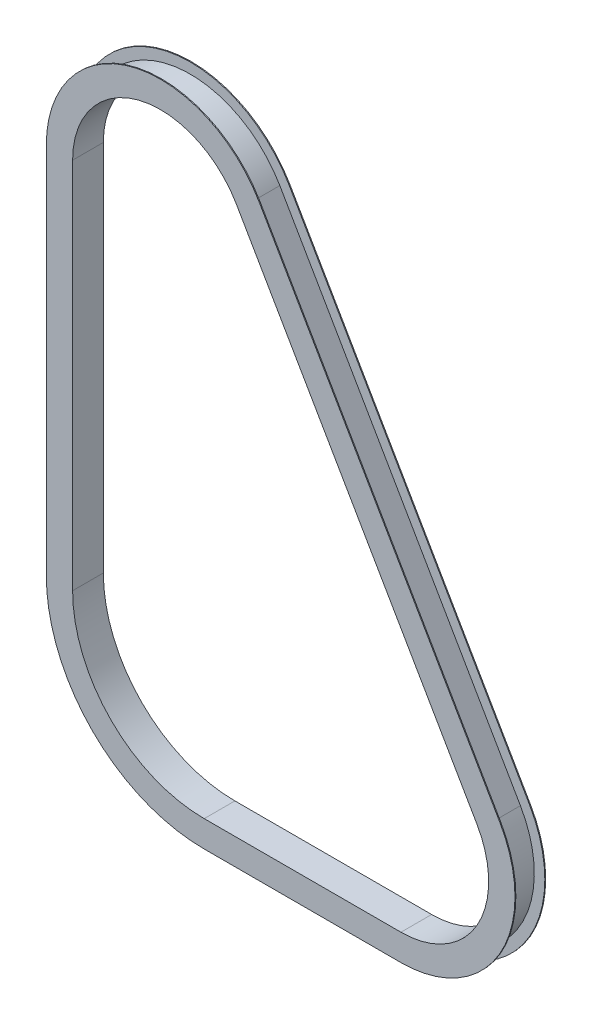
ISO-10303-21;
HEADER;
FILE_DESCRIPTION(('STEP AP214'),'2;1');
FILE_NAME('part.step','',(''),(''),'','','');
FILE_SCHEMA(('AUTOMOTIVE_DESIGN { 1 0 10303 214 1 1 1 1 }'));
ENDSEC;
DATA;
#1=APPLICATION_CONTEXT('core data for automotive mechanical design processes');
#2=APPLICATION_PROTOCOL_DEFINITION('international standard','automotive_design',2000,#1);
#3=PRODUCT_CONTEXT('',#1,'mechanical');
#4=PRODUCT('Part','Part','',(#3));
#5=PRODUCT_RELATED_PRODUCT_CATEGORY('part','',(#4));
#6=PRODUCT_DEFINITION_FORMATION('','',#4);
#7=PRODUCT_DEFINITION_CONTEXT('part definition',#1,'design');
#8=PRODUCT_DEFINITION('design','',#6,#7);
#9=PRODUCT_DEFINITION_SHAPE('','',#8);
#10=(LENGTH_UNIT() NAMED_UNIT(*) SI_UNIT(.MILLI.,.METRE.));
#11=(NAMED_UNIT(*) PLANE_ANGLE_UNIT() SI_UNIT($,.RADIAN.));
#12=(NAMED_UNIT(*) SI_UNIT($,.STERADIAN.) SOLID_ANGLE_UNIT());
#13=UNCERTAINTY_MEASURE_WITH_UNIT(LENGTH_MEASURE(1.E-05),#10,'distance_accuracy_value','');
#14=(GEOMETRIC_REPRESENTATION_CONTEXT(3) GLOBAL_UNCERTAINTY_ASSIGNED_CONTEXT((#13)) GLOBAL_UNIT_ASSIGNED_CONTEXT((#10,
#11,#12)) REPRESENTATION_CONTEXT('',''));
#15=CARTESIAN_POINT('',(0.,0.,0.));
#16=DIRECTION('',(0.,0.,1.));
#17=DIRECTION('',(1.,0.,0.));
#18=AXIS2_PLACEMENT_3D('',#15,#16,#17);
#19=CARTESIAN_POINT('',(50.,425.,-35.));
#20=DIRECTION('',(0.,0.,1.));
#21=DIRECTION('',(-1.,0.,0.));
#22=AXIS2_PLACEMENT_3D('',#19,#20,#21);
#23=CYLINDRICAL_SURFACE('',#22,130.);
#24=CARTESIAN_POINT('',(50.,425.,-1.));
#25=DIRECTION('',(0.,0.,-1.));
#26=DIRECTION('',(-1.,0.,0.));
#27=AXIS2_PLACEMENT_3D('',#24,#25,#26);
#28=CIRCLE('',#27,130.);
#29=CARTESIAN_POINT('',(-80.,425.,-1.));
#30=VERTEX_POINT('',#29);
#31=CARTESIAN_POINT('',(162.583302491977,490.000000000001,-1.));
#32=VERTEX_POINT('',#31);
#33=EDGE_CURVE('E340',#30,#32,#28,.T.);
#34=ORIENTED_EDGE('',*,*,#33,.F.);
#35=DIRECTION('',(0.,0.,1.));
#36=VECTOR('',#35,1.);
#37=CARTESIAN_POINT('',(-80.,425.,-35.));
#38=LINE('',#37,#36);
#39=CARTESIAN_POINT('',(-80.,425.,0.));
#40=VERTEX_POINT('',#39);
#41=EDGE_CURVE('E48',#30,#40,#38,.T.);
#42=ORIENTED_EDGE('',*,*,#41,.T.);
#43=CARTESIAN_POINT('',(50.,425.,0.));
#44=DIRECTION('',(0.,0.,1.));
#45=DIRECTION('',(1.,0.,0.));
#46=AXIS2_PLACEMENT_3D('',#43,#44,#45);
#47=CIRCLE('',#46,130.);
#48=CARTESIAN_POINT('',(162.583302491977,490.000000000001,0.));
#49=VERTEX_POINT('',#48);
#50=EDGE_CURVE('E226',#40,#49,#47,.F.);
#51=ORIENTED_EDGE('',*,*,#50,.T.);
#52=DIRECTION('',(0.,0.,1.));
#53=VECTOR('',#52,1.);
#54=CARTESIAN_POINT('',(162.583302491977,490.000000000001,-35.));
#55=LINE('',#54,#53);
#56=EDGE_CURVE('E203',#32,#49,#55,.T.);
#57=ORIENTED_EDGE('',*,*,#56,.F.);
#58=EDGE_LOOP('',(#34,#42,#51,#57));
#59=FACE_BOUND('',#58,.T.);
#60=ADVANCED_FACE('F39',(#59),#23,.T.);
#61=CARTESIAN_POINT('',(334.113700796171,192.900635094614,-35.));
#62=DIRECTION('',(0.866025403784436,0.500000000000004,0.));
#63=DIRECTION('',(-0.500000000000004,0.866025403784436,0.));
#64=AXIS2_PLACEMENT_3D('',#61,#62,#63);
#65=PLANE('',#64);
#66=ORIENTED_EDGE('',*,*,#56,.T.);
#67=DIRECTION('',(0.500000000000004,-0.866025403784436,0.));
#68=VECTOR('',#67,1.);
#69=CARTESIAN_POINT('',(334.113700796171,192.900635094614,0.));
#70=LINE('',#69,#68);
#71=CARTESIAN_POINT('',(436.824680357052,15.0000000000006,0.));
#72=VERTEX_POINT('',#71);
#73=EDGE_CURVE('E110',#49,#72,#70,.T.);
#74=ORIENTED_EDGE('',*,*,#73,.T.);
#75=DIRECTION('',(0.,0.,1.));
#76=VECTOR('',#75,1.);
#77=CARTESIAN_POINT('',(436.824680357052,15.0000000000006,-35.));
#78=LINE('',#77,#76);
#79=CARTESIAN_POINT('',(436.824680357052,15.0000000000007,-1.));
#80=VERTEX_POINT('',#79);
#81=EDGE_CURVE('E213',#80,#72,#78,.T.);
#82=ORIENTED_EDGE('',*,*,#81,.F.);
#83=DIRECTION('',(0.500000000000004,-0.866025403784436,0.));
#84=VECTOR('',#83,1.);
#85=CARTESIAN_POINT('',(162.583302491976,490.000000000001,-1.));
#86=LINE('',#85,#84);
#87=EDGE_CURVE('E326',#32,#80,#86,.T.);
#88=ORIENTED_EDGE('',*,*,#87,.F.);
#89=EDGE_LOOP('',(#66,#74,#82,#88));
#90=FACE_BOUND('',#89,.T.);
#91=ADVANCED_FACE('F444',(#90),#65,.T.);
#92=CARTESIAN_POINT('',(324.241377865075,-49.9999999999999,-35.));
#93=DIRECTION('',(0.,0.,1.));
#94=DIRECTION('',(-1.,0.,0.));
#95=AXIS2_PLACEMENT_3D('',#92,#93,#94);
#96=CYLINDRICAL_SURFACE('',#95,130.);
#97=CARTESIAN_POINT('',(324.241377865075,-49.9999999999999,-34.));
#98=DIRECTION('',(0.,0.,-1.));
#99=DIRECTION('',(0.866025403784436,0.500000000000004,0.));
#100=AXIS2_PLACEMENT_3D('',#97,#98,#99);
#101=CIRCLE('',#100,130.);
#102=CARTESIAN_POINT('',(436.824680357052,15.0000000000006,-34.));
#103=VERTEX_POINT('',#102);
#104=CARTESIAN_POINT('',(324.241377865075,-180.,-34.));
#105=VERTEX_POINT('',#104);
#106=EDGE_CURVE('E172',#103,#105,#101,.T.);
#107=ORIENTED_EDGE('',*,*,#106,.T.);
#108=DIRECTION('',(0.,0.,1.));
#109=VECTOR('',#108,1.);
#110=CARTESIAN_POINT('',(324.241377865075,-180.,-35.));
#111=LINE('',#110,#109);
#112=CARTESIAN_POINT('',(324.241377865075,-180.,-35.));
#113=VERTEX_POINT('',#112);
#114=EDGE_CURVE('E155',#113,#105,#111,.T.);
#115=ORIENTED_EDGE('',*,*,#114,.F.);
#116=CARTESIAN_POINT('',(324.241377865075,-49.9999999999999,-35.));
#117=DIRECTION('',(0.,0.,1.));
#118=DIRECTION('',(1.,0.,0.));
#119=AXIS2_PLACEMENT_3D('',#116,#117,#118);
#120=CIRCLE('',#119,130.);
#121=CARTESIAN_POINT('',(436.824680357052,15.0000000000006,-35.));
#122=VERTEX_POINT('',#121);
#123=EDGE_CURVE('E162',#122,#113,#120,.F.);
#124=ORIENTED_EDGE('',*,*,#123,.F.);
#125=EDGE_CURVE('E178',#122,#103,#78,.T.);
#126=ORIENTED_EDGE('',*,*,#125,.T.);
#127=EDGE_LOOP('',(#107,#115,#124,#126));
#128=FACE_BOUND('',#127,.T.);
#129=ADVANCED_FACE('F170',(#128),#96,.T.);
#130=CARTESIAN_POINT('',(0.,-180.,-35.));
#131=DIRECTION('',(0.,-1.,0.));
#132=DIRECTION('',(1.,0.,0.));
#133=AXIS2_PLACEMENT_3D('',#130,#131,#132);
#134=PLANE('',#133);
#135=CARTESIAN_POINT('',(324.241377865075,-180.,-1.));
#136=VERTEX_POINT('',#135);
#137=CARTESIAN_POINT('',(324.241377865075,-180.,0.));
#138=VERTEX_POINT('',#137);
#139=EDGE_CURVE('E174',#136,#138,#111,.T.);
#140=ORIENTED_EDGE('',*,*,#139,.T.);
#141=DIRECTION('',(-1.,0.,0.));
#142=VECTOR('',#141,1.);
#143=CARTESIAN_POINT('',(0.,-180.,0.));
#144=LINE('',#143,#142);
#145=CARTESIAN_POINT('',(100.,-180.,0.));
#146=VERTEX_POINT('',#145);
#147=EDGE_CURVE('E219',#138,#146,#144,.T.);
#148=ORIENTED_EDGE('',*,*,#147,.T.);
#149=DIRECTION('',(0.,0.,1.));
#150=VECTOR('',#149,1.);
#151=CARTESIAN_POINT('',(100.,-180.,-35.));
#152=LINE('',#151,#150);
#153=CARTESIAN_POINT('',(100.,-180.,-1.));
#154=VERTEX_POINT('',#153);
#155=EDGE_CURVE('E173',#154,#146,#152,.T.);
#156=ORIENTED_EDGE('',*,*,#155,.F.);
#157=DIRECTION('',(-1.,0.,0.));
#158=VECTOR('',#157,1.);
#159=CARTESIAN_POINT('',(324.241377865075,-180.,-1.));
#160=LINE('',#159,#158);
#161=EDGE_CURVE('E295',#136,#154,#160,.T.);
#162=ORIENTED_EDGE('',*,*,#161,.F.);
#163=EDGE_LOOP('',(#140,#148,#156,#162));
#164=FACE_BOUND('',#163,.T.);
#165=ADVANCED_FACE('F485',(#164),#134,.T.);
#166=CARTESIAN_POINT('',(100.,0.,-35.));
#167=DIRECTION('',(0.,0.,1.));
#168=DIRECTION('',(-1.,0.,0.));
#169=AXIS2_PLACEMENT_3D('',#166,#167,#168);
#170=CYLINDRICAL_SURFACE('',#169,180.);
#171=CARTESIAN_POINT('',(100.,0.,-1.));
#172=DIRECTION('',(0.,0.,1.));
#173=DIRECTION('',(-1.,0.,0.));
#174=AXIS2_PLACEMENT_3D('',#171,#172,#173);
#175=CIRCLE('',#174,180.);
#176=CARTESIAN_POINT('',(-80.,0.,-1.));
#177=VERTEX_POINT('',#176);
#178=EDGE_CURVE('E56',#177,#154,#175,.T.);
#179=ORIENTED_EDGE('',*,*,#178,.T.);
#180=ORIENTED_EDGE('',*,*,#155,.T.);
#181=CARTESIAN_POINT('',(100.,0.,0.));
#182=DIRECTION('',(0.,0.,1.));
#183=DIRECTION('',(1.,0.,0.));
#184=AXIS2_PLACEMENT_3D('',#181,#182,#183);
#185=CIRCLE('',#184,180.);
#186=CARTESIAN_POINT('',(-80.,0.,0.));
#187=VERTEX_POINT('',#186);
#188=EDGE_CURVE('E222',#187,#146,#185,.T.);
#189=ORIENTED_EDGE('',*,*,#188,.F.);
#190=DIRECTION('',(0.,0.,1.));
#191=VECTOR('',#190,1.);
#192=CARTESIAN_POINT('',(-80.,0.,-35.));
#193=LINE('',#192,#191);
#194=EDGE_CURVE('E182',#177,#187,#193,.T.);
#195=ORIENTED_EDGE('',*,*,#194,.F.);
#196=EDGE_LOOP('',(#179,#180,#189,#195));
#197=FACE_BOUND('',#196,.T.);
#198=ADVANCED_FACE('F486',(#197),#170,.T.);
#199=CARTESIAN_POINT('',(100.,0.,-34.));
#200=DIRECTION('',(0.,0.,1.));
#201=DIRECTION('',(-1.,0.,0.));
#202=AXIS2_PLACEMENT_3D('',#199,#200,#201);
#203=CIRCLE('',#202,180.);
#204=CARTESIAN_POINT('',(-80.,0.,-34.));
#205=VERTEX_POINT('',#204);
#206=CARTESIAN_POINT('',(100.,-180.,-34.));
#207=VERTEX_POINT('',#206);
#208=EDGE_CURVE('E286',#205,#207,#203,.T.);
#209=ORIENTED_EDGE('',*,*,#208,.F.);
#210=CARTESIAN_POINT('',(-80.,0.,-35.));
#211=VERTEX_POINT('',#210);
#212=EDGE_CURVE('E183',#211,#205,#193,.T.);
#213=ORIENTED_EDGE('',*,*,#212,.F.);
#214=CARTESIAN_POINT('',(100.,0.,-35.));
#215=DIRECTION('',(0.,0.,1.));
#216=DIRECTION('',(1.,0.,0.));
#217=AXIS2_PLACEMENT_3D('',#214,#215,#216);
#218=CIRCLE('',#217,180.);
#219=CARTESIAN_POINT('',(100.,-180.,-35.));
#220=VERTEX_POINT('',#219);
#221=EDGE_CURVE('E163',#211,#220,#218,.T.);
#222=ORIENTED_EDGE('',*,*,#221,.T.);
#223=EDGE_CURVE('E158',#220,#207,#152,.T.);
#224=ORIENTED_EDGE('',*,*,#223,.T.);
#225=EDGE_LOOP('',(#209,#213,#222,#224));
#226=FACE_BOUND('',#225,.T.);
#227=ADVANCED_FACE('F463',(#226),#170,.T.);
#228=CARTESIAN_POINT('',(-80.,0.,-35.));
#229=DIRECTION('',(-1.,0.,0.));
#230=DIRECTION('',(0.,0.,-1.));
#231=AXIS2_PLACEMENT_3D('',#228,#229,#230);
#232=PLANE('',#231);
#233=DIRECTION('',(0.,-1.,0.));
#234=VECTOR('',#233,1.);
#235=CARTESIAN_POINT('',(-80.,0.,-1.00000000000001));
#236=LINE('',#235,#234);
#237=EDGE_CURVE('E243',#30,#177,#236,.T.);
#238=ORIENTED_EDGE('',*,*,#237,.T.);
#239=ORIENTED_EDGE('',*,*,#194,.T.);
#240=DIRECTION('',(0.,1.,0.));
#241=VECTOR('',#240,1.);
#242=CARTESIAN_POINT('',(-80.,0.,0.));
#243=LINE('',#242,#241);
#244=EDGE_CURVE('E224',#187,#40,#243,.T.);
#245=ORIENTED_EDGE('',*,*,#244,.T.);
#246=ORIENTED_EDGE('',*,*,#41,.F.);
#247=EDGE_LOOP('',(#238,#239,#245,#246));
#248=FACE_BOUND('',#247,.T.);
#249=ADVANCED_FACE('F456',(#248),#232,.T.);
#250=CARTESIAN_POINT('',(50.,425.,-34.));
#251=DIRECTION('',(0.,0.,-1.));
#252=DIRECTION('',(-1.,0.,0.));
#253=AXIS2_PLACEMENT_3D('',#250,#251,#252);
#254=CIRCLE('',#253,130.);
#255=CARTESIAN_POINT('',(-80.,425.,-34.));
#256=VERTEX_POINT('',#255);
#257=CARTESIAN_POINT('',(162.583302491977,490.000000000001,-34.));
#258=VERTEX_POINT('',#257);
#259=EDGE_CURVE('E337',#256,#258,#254,.T.);
#260=ORIENTED_EDGE('',*,*,#259,.T.);
#261=CARTESIAN_POINT('',(162.583302491977,490.000000000001,-35.));
#262=VERTEX_POINT('',#261);
#263=EDGE_CURVE('E208',#262,#258,#55,.T.);
#264=ORIENTED_EDGE('',*,*,#263,.F.);
#265=CARTESIAN_POINT('',(50.,425.,-35.));
#266=DIRECTION('',(0.,0.,1.));
#267=DIRECTION('',(1.,0.,0.));
#268=AXIS2_PLACEMENT_3D('',#265,#266,#267);
#269=CIRCLE('',#268,130.);
#270=CARTESIAN_POINT('',(-80.,425.,-35.));
#271=VERTEX_POINT('',#270);
#272=EDGE_CURVE('E248',#271,#262,#269,.F.);
#273=ORIENTED_EDGE('',*,*,#272,.F.);
#274=EDGE_CURVE('E11',#271,#256,#38,.T.);
#275=ORIENTED_EDGE('',*,*,#274,.T.);
#276=EDGE_LOOP('',(#260,#264,#273,#275));
#277=FACE_BOUND('',#276,.T.);
#278=ADVANCED_FACE('F446',(#277),#23,.T.);
#279=DIRECTION('',(0.,1.,0.));
#280=VECTOR('',#279,1.);
#281=CARTESIAN_POINT('',(-80.,0.,-34.));
#282=LINE('',#281,#280);
#283=EDGE_CURVE('E265',#205,#256,#282,.T.);
#284=ORIENTED_EDGE('',*,*,#283,.T.);
#285=ORIENTED_EDGE('',*,*,#274,.F.);
#286=DIRECTION('',(0.,1.,0.));
#287=VECTOR('',#286,1.);
#288=CARTESIAN_POINT('',(-80.,0.,-35.));
#289=LINE('',#288,#287);
#290=EDGE_CURVE('E246',#211,#271,#289,.T.);
#291=ORIENTED_EDGE('',*,*,#290,.F.);
#292=ORIENTED_EDGE('',*,*,#212,.T.);
#293=EDGE_LOOP('',(#284,#285,#291,#292));
#294=FACE_BOUND('',#293,.T.);
#295=ADVANCED_FACE('F455',(#294),#232,.T.);
#296=DIRECTION('',(-1.,0.,0.));
#297=VECTOR('',#296,1.);
#298=CARTESIAN_POINT('',(324.241377865075,-180.,-34.));
#299=LINE('',#298,#297);
#300=EDGE_CURVE('E292',#105,#207,#299,.T.);
#301=ORIENTED_EDGE('',*,*,#300,.T.);
#302=ORIENTED_EDGE('',*,*,#223,.F.);
#303=DIRECTION('',(-1.,0.,0.));
#304=VECTOR('',#303,1.);
#305=CARTESIAN_POINT('',(0.,-180.,-35.));
#306=LINE('',#305,#304);
#307=EDGE_CURVE('E149',#113,#220,#306,.T.);
#308=ORIENTED_EDGE('',*,*,#307,.F.);
#309=ORIENTED_EDGE('',*,*,#114,.T.);
#310=EDGE_LOOP('',(#301,#302,#308,#309));
#311=FACE_BOUND('',#310,.T.);
#312=ADVANCED_FACE('F152',(#311),#134,.T.);
#313=CARTESIAN_POINT('',(324.241377865075,-49.9999999999999,-1.));
#314=DIRECTION('',(0.,0.,-1.));
#315=DIRECTION('',(0.866025403784436,0.500000000000004,0.));
#316=AXIS2_PLACEMENT_3D('',#313,#314,#315);
#317=CIRCLE('',#316,130.);
#318=EDGE_CURVE('E306',#80,#136,#317,.T.);
#319=ORIENTED_EDGE('',*,*,#318,.F.);
#320=ORIENTED_EDGE('',*,*,#81,.T.);
#321=CARTESIAN_POINT('',(324.241377865075,-49.9999999999999,0.));
#322=DIRECTION('',(0.,0.,1.));
#323=DIRECTION('',(1.,0.,0.));
#324=AXIS2_PLACEMENT_3D('',#321,#322,#323);
#325=CIRCLE('',#324,130.);
#326=EDGE_CURVE('E217',#72,#138,#325,.F.);
#327=ORIENTED_EDGE('',*,*,#326,.T.);
#328=ORIENTED_EDGE('',*,*,#139,.F.);
#329=EDGE_LOOP('',(#319,#320,#327,#328));
#330=FACE_BOUND('',#329,.T.);
#331=ADVANCED_FACE('F479',(#330),#96,.T.);
#332=CARTESIAN_POINT('',(-50.,0.,-35.));
#333=DIRECTION('',(-1.,0.,0.));
#334=DIRECTION('',(0.,-1.,0.));
#335=AXIS2_PLACEMENT_3D('',#332,#333,#334);
#336=PLANE('',#335);
#337=DIRECTION('',(0.,1.,0.));
#338=VECTOR('',#337,1.);
#339=CARTESIAN_POINT('',(-50.,0.,0.));
#340=LINE('',#339,#338);
#341=CARTESIAN_POINT('',(-50.,0.,0.));
#342=VERTEX_POINT('',#341);
#343=CARTESIAN_POINT('',(-50.,425.,0.));
#344=VERTEX_POINT('',#343);
#345=EDGE_CURVE('E241',#342,#344,#340,.T.);
#346=ORIENTED_EDGE('',*,*,#345,.F.);
#347=DIRECTION('',(0.,0.,1.));
#348=VECTOR('',#347,1.);
#349=CARTESIAN_POINT('',(-50.,0.,-35.));
#350=LINE('',#349,#348);
#351=CARTESIAN_POINT('',(-50.,0.,-35.));
#352=VERTEX_POINT('',#351);
#353=EDGE_CURVE('E186',#352,#342,#350,.T.);
#354=ORIENTED_EDGE('',*,*,#353,.F.);
#355=DIRECTION('',(0.,1.,0.));
#356=VECTOR('',#355,1.);
#357=CARTESIAN_POINT('',(-50.,0.,-35.));
#358=LINE('',#357,#356);
#359=CARTESIAN_POINT('',(-50.,425.,-35.));
#360=VERTEX_POINT('',#359);
#361=EDGE_CURVE('E216',#352,#360,#358,.T.);
#362=ORIENTED_EDGE('',*,*,#361,.T.);
#363=DIRECTION('',(0.,0.,1.));
#364=VECTOR('',#363,1.);
#365=CARTESIAN_POINT('',(-50.,425.,-35.));
#366=LINE('',#365,#364);
#367=EDGE_CURVE('E43',#360,#344,#366,.T.);
#368=ORIENTED_EDGE('',*,*,#367,.T.);
#369=EDGE_LOOP('',(#346,#354,#362,#368));
#370=FACE_BOUND('',#369,.T.);
#371=ADVANCED_FACE('F41',(#370),#336,.F.);
#372=CARTESIAN_POINT('',(50.,425.,-35.));
#373=DIRECTION('',(0.,0.,1.));
#374=DIRECTION('',(-1.,0.,0.));
#375=AXIS2_PLACEMENT_3D('',#372,#373,#374);
#376=CYLINDRICAL_SURFACE('',#375,100.);
#377=CARTESIAN_POINT('',(50.,425.,0.));
#378=DIRECTION('',(0.,0.,1.));
#379=DIRECTION('',(1.,0.,0.));
#380=AXIS2_PLACEMENT_3D('',#377,#378,#379);
#381=CIRCLE('',#380,100.);
#382=CARTESIAN_POINT('',(136.602540378444,475.,0.));
#383=VERTEX_POINT('',#382);
#384=EDGE_CURVE('E239',#344,#383,#381,.F.);
#385=ORIENTED_EDGE('',*,*,#384,.F.);
#386=ORIENTED_EDGE('',*,*,#367,.F.);
#387=CARTESIAN_POINT('',(50.,425.,-35.));
#388=DIRECTION('',(0.,0.,1.));
#389=DIRECTION('',(1.,0.,0.));
#390=AXIS2_PLACEMENT_3D('',#387,#388,#389);
#391=CIRCLE('',#390,100.);
#392=CARTESIAN_POINT('',(136.602540378444,475.,-35.));
#393=VERTEX_POINT('',#392);
#394=EDGE_CURVE('E119',#360,#393,#391,.F.);
#395=ORIENTED_EDGE('',*,*,#394,.T.);
#396=DIRECTION('',(0.,0.,1.));
#397=VECTOR('',#396,1.);
#398=CARTESIAN_POINT('',(136.602540378444,475.,-35.));
#399=LINE('',#398,#397);
#400=EDGE_CURVE('E197',#393,#383,#399,.T.);
#401=ORIENTED_EDGE('',*,*,#400,.T.);
#402=EDGE_LOOP('',(#385,#386,#395,#401));
#403=FACE_BOUND('',#402,.T.);
#404=ADVANCED_FACE('F517',(#403),#376,.F.);
#405=CARTESIAN_POINT('',(308.132938682638,177.900635094613,-35.));
#406=DIRECTION('',(0.866025403784436,0.500000000000004,0.));
#407=DIRECTION('',(-0.500000000000004,0.866025403784436,0.));
#408=AXIS2_PLACEMENT_3D('',#405,#406,#407);
#409=PLANE('',#408);
#410=DIRECTION('',(0.500000000000004,-0.866025403784436,0.));
#411=VECTOR('',#410,1.);
#412=CARTESIAN_POINT('',(308.132938682638,177.900635094613,0.));
#413=LINE('',#412,#411);
#414=CARTESIAN_POINT('',(410.843918243519,4.71844785465692E-13,0.));
#415=VERTEX_POINT('',#414);
#416=EDGE_CURVE('E236',#383,#415,#413,.T.);
#417=ORIENTED_EDGE('',*,*,#416,.F.);
#418=ORIENTED_EDGE('',*,*,#400,.F.);
#419=DIRECTION('',(0.500000000000004,-0.866025403784436,0.));
#420=VECTOR('',#419,1.);
#421=CARTESIAN_POINT('',(308.132938682638,177.900635094613,-35.));
#422=LINE('',#421,#420);
#423=CARTESIAN_POINT('',(410.843918243519,4.71844785465692E-13,-35.));
#424=VERTEX_POINT('',#423);
#425=EDGE_CURVE('E258',#393,#424,#422,.T.);
#426=ORIENTED_EDGE('',*,*,#425,.T.);
#427=DIRECTION('',(0.,0.,1.));
#428=VECTOR('',#427,1.);
#429=CARTESIAN_POINT('',(410.843918243519,4.71844785465692E-13,-35.));
#430=LINE('',#429,#428);
#431=EDGE_CURVE('E195',#424,#415,#430,.T.);
#432=ORIENTED_EDGE('',*,*,#431,.T.);
#433=EDGE_LOOP('',(#417,#418,#426,#432));
#434=FACE_BOUND('',#433,.T.);
#435=ADVANCED_FACE('F516',(#434),#409,.F.);
#436=CARTESIAN_POINT('',(324.241377865075,-49.9999999999999,-35.));
#437=DIRECTION('',(0.,0.,1.));
#438=DIRECTION('',(-1.,0.,0.));
#439=AXIS2_PLACEMENT_3D('',#436,#437,#438);
#440=CYLINDRICAL_SURFACE('',#439,100.);
#441=CARTESIAN_POINT('',(324.241377865075,-49.9999999999999,0.));
#442=DIRECTION('',(0.,0.,1.));
#443=DIRECTION('',(1.,0.,0.));
#444=AXIS2_PLACEMENT_3D('',#441,#442,#443);
#445=CIRCLE('',#444,100.);
#446=CARTESIAN_POINT('',(324.241377865075,-150.,0.));
#447=VERTEX_POINT('',#446);
#448=EDGE_CURVE('E233',#415,#447,#445,.F.);
#449=ORIENTED_EDGE('',*,*,#448,.F.);
#450=ORIENTED_EDGE('',*,*,#431,.F.);
#451=CARTESIAN_POINT('',(324.241377865075,-49.9999999999999,-35.));
#452=DIRECTION('',(0.,0.,1.));
#453=DIRECTION('',(1.,0.,0.));
#454=AXIS2_PLACEMENT_3D('',#451,#452,#453);
#455=CIRCLE('',#454,100.);
#456=CARTESIAN_POINT('',(324.241377865075,-150.,-35.));
#457=VERTEX_POINT('',#456);
#458=EDGE_CURVE('E255',#424,#457,#455,.F.);
#459=ORIENTED_EDGE('',*,*,#458,.T.);
#460=DIRECTION('',(0.,0.,1.));
#461=VECTOR('',#460,1.);
#462=CARTESIAN_POINT('',(324.241377865075,-150.,-35.));
#463=LINE('',#462,#461);
#464=EDGE_CURVE('E192',#457,#447,#463,.T.);
#465=ORIENTED_EDGE('',*,*,#464,.T.);
#466=EDGE_LOOP('',(#449,#450,#459,#465));
#467=FACE_BOUND('',#466,.T.);
#468=ADVANCED_FACE('F514',(#467),#440,.F.);
#469=CARTESIAN_POINT('',(0.,-150.,-35.));
#470=DIRECTION('',(0.,-1.,0.));
#471=DIRECTION('',(1.,0.,0.));
#472=AXIS2_PLACEMENT_3D('',#469,#470,#471);
#473=PLANE('',#472);
#474=DIRECTION('',(-1.,0.,0.));
#475=VECTOR('',#474,1.);
#476=CARTESIAN_POINT('',(0.,-150.,0.));
#477=LINE('',#476,#475);
#478=CARTESIAN_POINT('',(100.,-150.,0.));
#479=VERTEX_POINT('',#478);
#480=EDGE_CURVE('E230',#447,#479,#477,.T.);
#481=ORIENTED_EDGE('',*,*,#480,.F.);
#482=ORIENTED_EDGE('',*,*,#464,.F.);
#483=DIRECTION('',(-1.,0.,0.));
#484=VECTOR('',#483,1.);
#485=CARTESIAN_POINT('',(0.,-150.,-35.));
#486=LINE('',#485,#484);
#487=CARTESIAN_POINT('',(100.,-150.,-35.));
#488=VERTEX_POINT('',#487);
#489=EDGE_CURVE('E252',#457,#488,#486,.T.);
#490=ORIENTED_EDGE('',*,*,#489,.T.);
#491=DIRECTION('',(0.,0.,1.));
#492=VECTOR('',#491,1.);
#493=CARTESIAN_POINT('',(100.,-150.,-35.));
#494=LINE('',#493,#492);
#495=EDGE_CURVE('E189',#488,#479,#494,.T.);
#496=ORIENTED_EDGE('',*,*,#495,.T.);
#497=EDGE_LOOP('',(#481,#482,#490,#496));
#498=FACE_BOUND('',#497,.T.);
#499=ADVANCED_FACE('F475',(#498),#473,.F.);
#500=CARTESIAN_POINT('',(100.,0.,-35.));
#501=DIRECTION('',(0.,0.,1.));
#502=DIRECTION('',(-1.,0.,0.));
#503=AXIS2_PLACEMENT_3D('',#500,#501,#502);
#504=CYLINDRICAL_SURFACE('',#503,150.);
#505=CARTESIAN_POINT('',(100.,0.,0.));
#506=DIRECTION('',(0.,0.,1.));
#507=DIRECTION('',(1.,0.,0.));
#508=AXIS2_PLACEMENT_3D('',#505,#506,#507);
#509=CIRCLE('',#508,150.);
#510=EDGE_CURVE('E228',#342,#479,#509,.T.);
#511=ORIENTED_EDGE('',*,*,#510,.T.);
#512=ORIENTED_EDGE('',*,*,#495,.F.);
#513=CARTESIAN_POINT('',(100.,0.,-35.));
#514=DIRECTION('',(0.,0.,1.));
#515=DIRECTION('',(1.,0.,0.));
#516=AXIS2_PLACEMENT_3D('',#513,#514,#515);
#517=CIRCLE('',#516,150.);
#518=EDGE_CURVE('E250',#352,#488,#517,.T.);
#519=ORIENTED_EDGE('',*,*,#518,.F.);
#520=ORIENTED_EDGE('',*,*,#353,.T.);
#521=EDGE_LOOP('',(#511,#512,#519,#520));
#522=FACE_BOUND('',#521,.T.);
#523=ADVANCED_FACE('F469',(#522),#504,.F.);
#524=DIRECTION('',(0.500000000000004,-0.866025403784436,0.));
#525=VECTOR('',#524,1.);
#526=CARTESIAN_POINT('',(162.583302491976,490.000000000001,-34.));
#527=LINE('',#526,#525);
#528=EDGE_CURVE('E330',#258,#103,#527,.T.);
#529=ORIENTED_EDGE('',*,*,#528,.T.);
#530=ORIENTED_EDGE('',*,*,#125,.F.);
#531=DIRECTION('',(0.500000000000004,-0.866025403784436,0.));
#532=VECTOR('',#531,1.);
#533=CARTESIAN_POINT('',(334.113700796171,192.900635094614,-35.));
#534=LINE('',#533,#532);
#535=EDGE_CURVE('E65',#262,#122,#534,.T.);
#536=ORIENTED_EDGE('',*,*,#535,.F.);
#537=ORIENTED_EDGE('',*,*,#263,.T.);
#538=EDGE_LOOP('',(#529,#530,#536,#537));
#539=FACE_BOUND('',#538,.T.);
#540=ADVANCED_FACE('F451',(#539),#65,.T.);
#541=CARTESIAN_POINT('',(0.,0.,-35.));
#542=DIRECTION('',(0.,0.,-1.));
#543=DIRECTION('',(1.,0.,0.));
#544=AXIS2_PLACEMENT_3D('',#541,#542,#543);
#545=PLANE('',#544);
#546=ORIENTED_EDGE('',*,*,#361,.F.);
#547=ORIENTED_EDGE('',*,*,#518,.T.);
#548=ORIENTED_EDGE('',*,*,#489,.F.);
#549=ORIENTED_EDGE('',*,*,#458,.F.);
#550=ORIENTED_EDGE('',*,*,#425,.F.);
#551=ORIENTED_EDGE('',*,*,#394,.F.);
#552=EDGE_LOOP('',(#546,#547,#548,#549,#550,#551));
#553=FACE_BOUND('',#552,.T.);
#554=ORIENTED_EDGE('',*,*,#272,.T.);
#555=ORIENTED_EDGE('',*,*,#535,.T.);
#556=ORIENTED_EDGE('',*,*,#123,.T.);
#557=ORIENTED_EDGE('',*,*,#307,.T.);
#558=ORIENTED_EDGE('',*,*,#221,.F.);
#559=ORIENTED_EDGE('',*,*,#290,.T.);
#560=EDGE_LOOP('',(#554,#555,#556,#557,#558,#559));
#561=FACE_BOUND('',#560,.T.);
#562=ADVANCED_FACE('F166',(#553,#561),#545,.T.);
#563=CARTESIAN_POINT('',(0.,0.,0.));
#564=DIRECTION('',(0.,0.,-1.));
#565=DIRECTION('',(1.,0.,0.));
#566=AXIS2_PLACEMENT_3D('',#563,#564,#565);
#567=PLANE('',#566);
#568=ORIENTED_EDGE('',*,*,#345,.T.);
#569=ORIENTED_EDGE('',*,*,#384,.T.);
#570=ORIENTED_EDGE('',*,*,#416,.T.);
#571=ORIENTED_EDGE('',*,*,#448,.T.);
#572=ORIENTED_EDGE('',*,*,#480,.T.);
#573=ORIENTED_EDGE('',*,*,#510,.F.);
#574=EDGE_LOOP('',(#568,#569,#570,#571,#572,#573));
#575=FACE_BOUND('',#574,.T.);
#576=ORIENTED_EDGE('',*,*,#50,.F.);
#577=ORIENTED_EDGE('',*,*,#244,.F.);
#578=ORIENTED_EDGE('',*,*,#188,.T.);
#579=ORIENTED_EDGE('',*,*,#147,.F.);
#580=ORIENTED_EDGE('',*,*,#326,.F.);
#581=ORIENTED_EDGE('',*,*,#73,.F.);
#582=EDGE_LOOP('',(#576,#577,#578,#579,#580,#581));
#583=FACE_BOUND('',#582,.T.);
#584=ADVANCED_FACE('F441',(#575,#583),#567,.F.);
#585=CARTESIAN_POINT('',(-68.,0.,-34.));
#586=DIRECTION('',(1.,0.,0.));
#587=DIRECTION('',(0.,0.,1.));
#588=AXIS2_PLACEMENT_3D('',#585,#586,#587);
#589=PLANE('',#588);
#590=DIRECTION('',(0.,1.,0.));
#591=VECTOR('',#590,1.);
#592=CARTESIAN_POINT('',(-68.,0.,-1.));
#593=LINE('',#592,#591);
#594=CARTESIAN_POINT('',(-68.,0.,-1.));
#595=VERTEX_POINT('',#594);
#596=CARTESIAN_POINT('',(-68.,425.,-1.));
#597=VERTEX_POINT('',#596);
#598=EDGE_CURVE('E268',#595,#597,#593,.T.);
#599=ORIENTED_EDGE('',*,*,#598,.T.);
#600=DIRECTION('',(0.,0.,1.));
#601=VECTOR('',#600,1.);
#602=CARTESIAN_POINT('',(-68.,425.,-34.));
#603=LINE('',#602,#601);
#604=CARTESIAN_POINT('',(-68.,425.,-34.));
#605=VERTEX_POINT('',#604);
#606=EDGE_CURVE('E272',#605,#597,#603,.T.);
#607=ORIENTED_EDGE('',*,*,#606,.F.);
#608=DIRECTION('',(0.,1.,0.));
#609=VECTOR('',#608,1.);
#610=CARTESIAN_POINT('',(-68.,0.,-34.));
#611=LINE('',#610,#609);
#612=CARTESIAN_POINT('',(-68.,0.,-34.));
#613=VERTEX_POINT('',#612);
#614=EDGE_CURVE('E269',#613,#605,#611,.T.);
#615=ORIENTED_EDGE('',*,*,#614,.F.);
#616=DIRECTION('',(0.,0.,1.));
#617=VECTOR('',#616,1.);
#618=CARTESIAN_POINT('',(-68.,0.,-34.));
#619=LINE('',#618,#617);
#620=EDGE_CURVE('E273',#613,#595,#619,.T.);
#621=ORIENTED_EDGE('',*,*,#620,.T.);
#622=EDGE_LOOP('',(#599,#607,#615,#621));
#623=FACE_BOUND('',#622,.T.);
#624=ADVANCED_FACE('F420',(#623),#589,.F.);
#625=CARTESIAN_POINT('',(-68.,0.,-1.));
#626=DIRECTION('',(0.,0.,1.));
#627=DIRECTION('',(-1.,0.,0.));
#628=AXIS2_PLACEMENT_3D('',#625,#626,#627);
#629=PLANE('',#628);
#630=ORIENTED_EDGE('',*,*,#33,.T.);
#631=ORIENTED_EDGE('',*,*,#87,.T.);
#632=ORIENTED_EDGE('',*,*,#318,.T.);
#633=ORIENTED_EDGE('',*,*,#161,.T.);
#634=ORIENTED_EDGE('',*,*,#178,.F.);
#635=ORIENTED_EDGE('',*,*,#237,.F.);
#636=EDGE_LOOP('',(#630,#631,#632,#633,#634,#635));
#637=FACE_BOUND('',#636,.T.);
#638=ORIENTED_EDGE('',*,*,#598,.F.);
#639=CARTESIAN_POINT('',(100.,0.,-1.));
#640=DIRECTION('',(0.,0.,1.));
#641=DIRECTION('',(-1.,0.,0.));
#642=AXIS2_PLACEMENT_3D('',#639,#640,#641);
#643=CIRCLE('',#642,168.);
#644=CARTESIAN_POINT('',(100.,-168.,-1.));
#645=VERTEX_POINT('',#644);
#646=EDGE_CURVE('E289',#595,#645,#643,.T.);
#647=ORIENTED_EDGE('',*,*,#646,.T.);
#648=DIRECTION('',(-1.,0.,0.));
#649=VECTOR('',#648,1.);
#650=CARTESIAN_POINT('',(324.241377865075,-168.,-1.));
#651=LINE('',#650,#649);
#652=CARTESIAN_POINT('',(324.241377865075,-168.,-1.));
#653=VERTEX_POINT('',#652);
#654=EDGE_CURVE('E297',#653,#645,#651,.T.);
#655=ORIENTED_EDGE('',*,*,#654,.F.);
#656=CARTESIAN_POINT('',(324.241377865075,-49.9999999999999,-1.));
#657=DIRECTION('',(0.,0.,-1.));
#658=DIRECTION('',(0.866025403784436,0.500000000000004,0.));
#659=AXIS2_PLACEMENT_3D('',#656,#657,#658);
#660=CIRCLE('',#659,118.);
#661=CARTESIAN_POINT('',(426.432375511639,9.00000000000055,-1.));
#662=VERTEX_POINT('',#661);
#663=EDGE_CURVE('E309',#662,#653,#660,.T.);
#664=ORIENTED_EDGE('',*,*,#663,.F.);
#665=DIRECTION('',(0.500000000000004,-0.866025403784436,0.));
#666=VECTOR('',#665,1.);
#667=CARTESIAN_POINT('',(152.190997646563,484.000000000001,-1.));
#668=LINE('',#667,#666);
#669=CARTESIAN_POINT('',(152.190997646563,484.000000000001,-1.));
#670=VERTEX_POINT('',#669);
#671=EDGE_CURVE('E316',#670,#662,#668,.T.);
#672=ORIENTED_EDGE('',*,*,#671,.F.);
#673=CARTESIAN_POINT('',(50.,425.,-1.));
#674=DIRECTION('',(0.,0.,-1.));
#675=DIRECTION('',(-1.,0.,0.));
#676=AXIS2_PLACEMENT_3D('',#673,#674,#675);
#677=CIRCLE('',#676,118.);
#678=EDGE_CURVE('E341',#597,#670,#677,.T.);
#679=ORIENTED_EDGE('',*,*,#678,.F.);
#680=EDGE_LOOP('',(#638,#647,#655,#664,#672,#679));
#681=FACE_BOUND('',#680,.T.);
#682=ADVANCED_FACE('F349',(#637,#681),#629,.F.);
#683=CARTESIAN_POINT('',(-68.,0.,-34.));
#684=DIRECTION('',(0.,0.,-1.));
#685=DIRECTION('',(1.,0.,0.));
#686=AXIS2_PLACEMENT_3D('',#683,#684,#685);
#687=PLANE('',#686);
#688=CARTESIAN_POINT('',(50.,425.,-34.));
#689=DIRECTION('',(0.,0.,-1.));
#690=DIRECTION('',(-1.,0.,0.));
#691=AXIS2_PLACEMENT_3D('',#688,#689,#690);
#692=CIRCLE('',#691,118.);
#693=CARTESIAN_POINT('',(152.190997646563,484.000000000001,-34.));
#694=VERTEX_POINT('',#693);
#695=EDGE_CURVE('E327',#605,#694,#692,.T.);
#696=ORIENTED_EDGE('',*,*,#695,.T.);
#697=DIRECTION('',(0.500000000000004,-0.866025403784436,0.));
#698=VECTOR('',#697,1.);
#699=CARTESIAN_POINT('',(152.190997646563,484.000000000001,-34.));
#700=LINE('',#699,#698);
#701=CARTESIAN_POINT('',(426.432375511639,9.00000000000055,-34.));
#702=VERTEX_POINT('',#701);
#703=EDGE_CURVE('E322',#694,#702,#700,.T.);
#704=ORIENTED_EDGE('',*,*,#703,.T.);
#705=CARTESIAN_POINT('',(324.241377865075,-49.9999999999999,-34.));
#706=DIRECTION('',(0.,0.,-1.));
#707=DIRECTION('',(0.866025403784436,0.500000000000004,0.));
#708=AXIS2_PLACEMENT_3D('',#705,#706,#707);
#709=CIRCLE('',#708,118.);
#710=CARTESIAN_POINT('',(324.241377865075,-168.,-34.));
#711=VERTEX_POINT('',#710);
#712=EDGE_CURVE('E312',#702,#711,#709,.T.);
#713=ORIENTED_EDGE('',*,*,#712,.T.);
#714=DIRECTION('',(-1.,0.,0.));
#715=VECTOR('',#714,1.);
#716=CARTESIAN_POINT('',(324.241377865075,-168.,-34.));
#717=LINE('',#716,#715);
#718=CARTESIAN_POINT('',(100.,-168.,-34.));
#719=VERTEX_POINT('',#718);
#720=EDGE_CURVE('E298',#711,#719,#717,.T.);
#721=ORIENTED_EDGE('',*,*,#720,.T.);
#722=CARTESIAN_POINT('',(100.,0.,-34.));
#723=DIRECTION('',(0.,0.,1.));
#724=DIRECTION('',(-1.,0.,0.));
#725=AXIS2_PLACEMENT_3D('',#722,#723,#724);
#726=CIRCLE('',#725,168.);
#727=EDGE_CURVE('E283',#613,#719,#726,.T.);
#728=ORIENTED_EDGE('',*,*,#727,.F.);
#729=ORIENTED_EDGE('',*,*,#614,.T.);
#730=EDGE_LOOP('',(#696,#704,#713,#721,#728,#729));
#731=FACE_BOUND('',#730,.T.);
#732=ORIENTED_EDGE('',*,*,#283,.F.);
#733=ORIENTED_EDGE('',*,*,#208,.T.);
#734=ORIENTED_EDGE('',*,*,#300,.F.);
#735=ORIENTED_EDGE('',*,*,#106,.F.);
#736=ORIENTED_EDGE('',*,*,#528,.F.);
#737=ORIENTED_EDGE('',*,*,#259,.F.);
#738=EDGE_LOOP('',(#732,#733,#734,#735,#736,#737));
#739=FACE_BOUND('',#738,.T.);
#740=ADVANCED_FACE('F412',(#731,#739),#687,.F.);
#741=CARTESIAN_POINT('',(100.,0.,-35.));
#742=DIRECTION('',(0.,0.,-1.));
#743=DIRECTION('',(1.,0.,0.));
#744=AXIS2_PLACEMENT_3D('',#741,#742,#743);
#745=CYLINDRICAL_SURFACE('',#744,168.);
#746=DIRECTION('',(0.,0.,1.));
#747=VECTOR('',#746,1.);
#748=CARTESIAN_POINT('',(100.,-168.,-34.));
#749=LINE('',#748,#747);
#750=EDGE_CURVE('E280',#719,#645,#749,.T.);
#751=ORIENTED_EDGE('',*,*,#750,.T.);
#752=ORIENTED_EDGE('',*,*,#646,.F.);
#753=ORIENTED_EDGE('',*,*,#620,.F.);
#754=ORIENTED_EDGE('',*,*,#727,.T.);
#755=EDGE_LOOP('',(#751,#752,#753,#754));
#756=FACE_BOUND('',#755,.T.);
#757=ADVANCED_FACE('F417',(#756),#745,.T.);
#758=CARTESIAN_POINT('',(324.241377865075,-168.,-34.));
#759=DIRECTION('',(0.,1.,0.));
#760=DIRECTION('',(-1.,0.,0.));
#761=AXIS2_PLACEMENT_3D('',#758,#759,#760);
#762=PLANE('',#761);
#763=ORIENTED_EDGE('',*,*,#654,.T.);
#764=ORIENTED_EDGE('',*,*,#750,.F.);
#765=ORIENTED_EDGE('',*,*,#720,.F.);
#766=DIRECTION('',(0.,0.,1.));
#767=VECTOR('',#766,1.);
#768=CARTESIAN_POINT('',(324.241377865075,-168.,-34.));
#769=LINE('',#768,#767);
#770=EDGE_CURVE('E301',#711,#653,#769,.T.);
#771=ORIENTED_EDGE('',*,*,#770,.T.);
#772=EDGE_LOOP('',(#763,#764,#765,#771));
#773=FACE_BOUND('',#772,.T.);
#774=ADVANCED_FACE('F433',(#773),#762,.F.);
#775=CARTESIAN_POINT('',(324.241377865075,-49.9999999999999,-35.));
#776=DIRECTION('',(0.,0.,1.));
#777=DIRECTION('',(-1.,0.,0.));
#778=AXIS2_PLACEMENT_3D('',#775,#776,#777);
#779=CYLINDRICAL_SURFACE('',#778,118.);
#780=ORIENTED_EDGE('',*,*,#663,.T.);
#781=ORIENTED_EDGE('',*,*,#770,.F.);
#782=ORIENTED_EDGE('',*,*,#712,.F.);
#783=DIRECTION('',(0.,0.,1.));
#784=VECTOR('',#783,1.);
#785=CARTESIAN_POINT('',(426.432375511639,9.00000000000068,-34.));
#786=LINE('',#785,#784);
#787=EDGE_CURVE('E313',#702,#662,#786,.T.);
#788=ORIENTED_EDGE('',*,*,#787,.T.);
#789=EDGE_LOOP('',(#780,#781,#782,#788));
#790=FACE_BOUND('',#789,.T.);
#791=ADVANCED_FACE('F430',(#790),#779,.T.);
#792=CARTESIAN_POINT('',(152.190997646563,484.000000000001,-34.));
#793=DIRECTION('',(-0.866025403784436,-0.500000000000004,0.));
#794=DIRECTION('',(0.500000000000004,-0.866025403784436,0.));
#795=AXIS2_PLACEMENT_3D('',#792,#793,#794);
#796=PLANE('',#795);
#797=ORIENTED_EDGE('',*,*,#671,.T.);
#798=ORIENTED_EDGE('',*,*,#787,.F.);
#799=ORIENTED_EDGE('',*,*,#703,.F.);
#800=DIRECTION('',(0.,0.,1.));
#801=VECTOR('',#800,1.);
#802=CARTESIAN_POINT('',(152.190997646563,484.000000000001,-34.));
#803=LINE('',#802,#801);
#804=EDGE_CURVE('E323',#694,#670,#803,.T.);
#805=ORIENTED_EDGE('',*,*,#804,.T.);
#806=EDGE_LOOP('',(#797,#798,#799,#805));
#807=FACE_BOUND('',#806,.T.);
#808=ADVANCED_FACE('F427',(#807),#796,.F.);
#809=CARTESIAN_POINT('',(50.,425.,-35.));
#810=DIRECTION('',(0.,0.,1.));
#811=DIRECTION('',(-1.,0.,0.));
#812=AXIS2_PLACEMENT_3D('',#809,#810,#811);
#813=CYLINDRICAL_SURFACE('',#812,118.);
#814=ORIENTED_EDGE('',*,*,#804,.F.);
#815=ORIENTED_EDGE('',*,*,#695,.F.);
#816=ORIENTED_EDGE('',*,*,#606,.T.);
#817=ORIENTED_EDGE('',*,*,#678,.T.);
#818=EDGE_LOOP('',(#814,#815,#816,#817));
#819=FACE_BOUND('',#818,.T.);
#820=ADVANCED_FACE('F422',(#819),#813,.T.);
#821=CLOSED_SHELL('',(#60,#91,#129,#165,#198,#227,#249,#278,#295,#312,#331,#371,#404,#435,#468,
#499,#523,#540,#562,#584,#624,#682,#740,#757,#774,#791,#808,#820));
#822=MANIFOLD_SOLID_BREP('B2',#821);
#823=ADVANCED_BREP_SHAPE_REPRESENTATION('',(#18,#822),#14);
#824=SHAPE_DEFINITION_REPRESENTATION(#9,#823);
ENDSEC;
END-ISO-10303-21;
